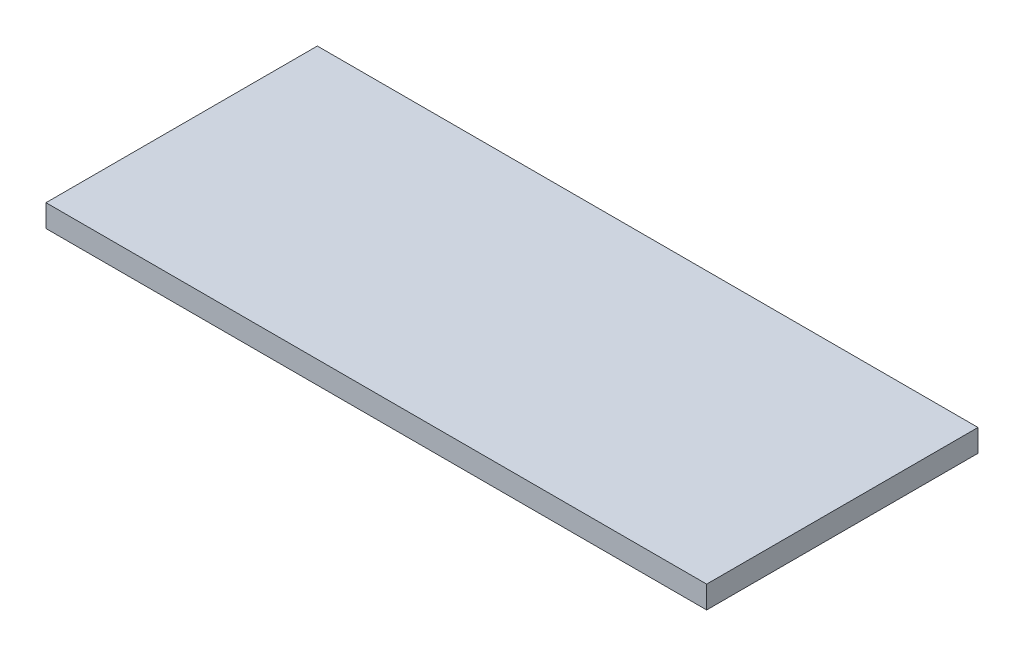
ISO-10303-21;
HEADER;
FILE_DESCRIPTION(('STEP AP214'),'2;1');
FILE_NAME('part.step','',(''),(''),'','','');
FILE_SCHEMA(('AUTOMOTIVE_DESIGN { 1 0 10303 214 1 1 1 1 }'));
ENDSEC;
DATA;
#1=APPLICATION_CONTEXT('core data for automotive mechanical design processes');
#2=APPLICATION_PROTOCOL_DEFINITION('international standard','automotive_design',2000,#1);
#3=PRODUCT_CONTEXT('',#1,'mechanical');
#4=PRODUCT('Part','Part','',(#3));
#5=PRODUCT_RELATED_PRODUCT_CATEGORY('part','',(#4));
#6=PRODUCT_DEFINITION_FORMATION('','',#4);
#7=PRODUCT_DEFINITION_CONTEXT('part definition',#1,'design');
#8=PRODUCT_DEFINITION('design','',#6,#7);
#9=PRODUCT_DEFINITION_SHAPE('','',#8);
#10=(LENGTH_UNIT() NAMED_UNIT(*) SI_UNIT(.MILLI.,.METRE.));
#11=(NAMED_UNIT(*) PLANE_ANGLE_UNIT() SI_UNIT($,.RADIAN.));
#12=(NAMED_UNIT(*) SI_UNIT($,.STERADIAN.) SOLID_ANGLE_UNIT());
#13=UNCERTAINTY_MEASURE_WITH_UNIT(LENGTH_MEASURE(1.E-05),#10,'distance_accuracy_value','');
#14=(GEOMETRIC_REPRESENTATION_CONTEXT(3) GLOBAL_UNCERTAINTY_ASSIGNED_CONTEXT((#13)) GLOBAL_UNIT_ASSIGNED_CONTEXT((#10,
#11,#12)) REPRESENTATION_CONTEXT('',''));
#15=CARTESIAN_POINT('',(0.,0.,0.));
#16=DIRECTION('',(0.,0.,1.));
#17=DIRECTION('',(1.,0.,0.));
#18=AXIS2_PLACEMENT_3D('',#15,#16,#17);
#19=CARTESIAN_POINT('',(0.05,0.832,0.24));
#20=DIRECTION('',(1.,0.,0.));
#21=DIRECTION('',(0.,0.,-1.));
#22=AXIS2_PLACEMENT_3D('',#19,#20,#21);
#23=PLANE('',#22);
#24=DIRECTION('',(0.,0.,-1.));
#25=VECTOR('',#24,1.);
#26=CARTESIAN_POINT('',(0.05,-0.0999999999999999,1.41968162443208));
#27=LINE('',#26,#25);
#28=CARTESIAN_POINT('',(0.0499999999999999,-0.1,0.24));
#29=VERTEX_POINT('',#28);
#30=CARTESIAN_POINT('',(0.0499999999999999,-0.1,-0.22));
#31=VERTEX_POINT('',#30);
#32=EDGE_CURVE('E87',#29,#31,#27,.T.);
#33=ORIENTED_EDGE('',*,*,#32,.T.);
#34=DIRECTION('',(0.,-1.,0.));
#35=VECTOR('',#34,1.);
#36=CARTESIAN_POINT('',(0.05,0.832,-0.22));
#37=LINE('',#36,#35);
#38=CARTESIAN_POINT('',(0.05,-0.138,-0.22));
#39=VERTEX_POINT('',#38);
#40=EDGE_CURVE('E113',#31,#39,#37,.T.);
#41=ORIENTED_EDGE('',*,*,#40,.T.);
#42=DIRECTION('',(0.,0.,-1.));
#43=VECTOR('',#42,1.);
#44=CARTESIAN_POINT('',(0.05,-0.138,1.41968162443208));
#45=LINE('',#44,#43);
#46=CARTESIAN_POINT('',(0.05,-0.138,0.24));
#47=VERTEX_POINT('',#46);
#48=EDGE_CURVE('E119',#47,#39,#45,.T.);
#49=ORIENTED_EDGE('',*,*,#48,.F.);
#50=DIRECTION('',(0.,1.,0.));
#51=VECTOR('',#50,1.);
#52=CARTESIAN_POINT('',(0.05,0.,0.24));
#53=LINE('',#52,#51);
#54=EDGE_CURVE('E50',#47,#29,#53,.T.);
#55=ORIENTED_EDGE('',*,*,#54,.T.);
#56=EDGE_LOOP('',(#33,#41,#49,#55));
#57=FACE_BOUND('',#56,.T.);
#58=ADVANCED_FACE('F33',(#57),#23,.F.);
#59=CARTESIAN_POINT('',(1.17,0.546,0.24));
#60=DIRECTION('',(-1.,0.,0.));
#61=DIRECTION('',(0.,0.,1.));
#62=AXIS2_PLACEMENT_3D('',#59,#60,#61);
#63=PLANE('',#62);
#64=DIRECTION('',(0.,0.,-1.));
#65=VECTOR('',#64,1.);
#66=CARTESIAN_POINT('',(1.17,-0.138,1.41968162443208));
#67=LINE('',#66,#65);
#68=CARTESIAN_POINT('',(1.17,-0.138,0.24));
#69=VERTEX_POINT('',#68);
#70=CARTESIAN_POINT('',(1.17,-0.138,-0.22));
#71=VERTEX_POINT('',#70);
#72=EDGE_CURVE('E76',#69,#71,#67,.T.);
#73=ORIENTED_EDGE('',*,*,#72,.T.);
#74=DIRECTION('',(0.,-1.,0.));
#75=VECTOR('',#74,1.);
#76=CARTESIAN_POINT('',(1.17,0.832,-0.22));
#77=LINE('',#76,#75);
#78=CARTESIAN_POINT('',(1.17,-0.1,-0.22));
#79=VERTEX_POINT('',#78);
#80=EDGE_CURVE('E37',#79,#71,#77,.T.);
#81=ORIENTED_EDGE('',*,*,#80,.F.);
#82=DIRECTION('',(0.,0.,-1.));
#83=VECTOR('',#82,1.);
#84=CARTESIAN_POINT('',(1.17,-0.0999999999999999,1.41968162443208));
#85=LINE('',#84,#83);
#86=CARTESIAN_POINT('',(1.17,-0.1,0.24));
#87=VERTEX_POINT('',#86);
#88=EDGE_CURVE('E78',#87,#79,#85,.T.);
#89=ORIENTED_EDGE('',*,*,#88,.F.);
#90=DIRECTION('',(0.,-1.,0.));
#91=VECTOR('',#90,1.);
#92=CARTESIAN_POINT('',(1.17,0.,0.24));
#93=LINE('',#92,#91);
#94=EDGE_CURVE('E55',#87,#69,#93,.T.);
#95=ORIENTED_EDGE('',*,*,#94,.T.);
#96=EDGE_LOOP('',(#73,#81,#89,#95));
#97=FACE_BOUND('',#96,.T.);
#98=ADVANCED_FACE('F74',(#97),#63,.F.);
#99=CARTESIAN_POINT('',(1.17,0.832,-0.22));
#100=DIRECTION('',(0.,0.,1.));
#101=DIRECTION('',(0.,-1.,0.));
#102=AXIS2_PLACEMENT_3D('',#99,#100,#101);
#103=PLANE('',#102);
#104=ORIENTED_EDGE('',*,*,#80,.T.);
#105=DIRECTION('',(1.,0.,0.));
#106=VECTOR('',#105,1.);
#107=CARTESIAN_POINT('',(1.17,-0.138,-0.22));
#108=LINE('',#107,#106);
#109=EDGE_CURVE('E85',#39,#71,#108,.T.);
#110=ORIENTED_EDGE('',*,*,#109,.F.);
#111=ORIENTED_EDGE('',*,*,#40,.F.);
#112=DIRECTION('',(-1.,0.,0.));
#113=VECTOR('',#112,1.);
#114=CARTESIAN_POINT('',(1.19,-0.1,-0.22));
#115=LINE('',#114,#113);
#116=EDGE_CURVE('E80',#79,#31,#115,.T.);
#117=ORIENTED_EDGE('',*,*,#116,.F.);
#118=EDGE_LOOP('',(#104,#110,#111,#117));
#119=FACE_BOUND('',#118,.T.);
#120=ADVANCED_FACE('F96',(#119),#103,.F.);
#121=CARTESIAN_POINT('',(1.19,-0.0999999999999999,0.22));
#122=DIRECTION('',(0.,-1.,0.));
#123=DIRECTION('',(0.,0.,-1.));
#124=AXIS2_PLACEMENT_3D('',#121,#122,#123);
#125=PLANE('',#124);
#126=ORIENTED_EDGE('',*,*,#32,.F.);
#127=DIRECTION('',(1.,0.,0.));
#128=VECTOR('',#127,1.);
#129=CARTESIAN_POINT('',(0.0499999999999999,-0.1,0.24));
#130=LINE('',#129,#128);
#131=EDGE_CURVE('E42',#29,#87,#130,.T.);
#132=ORIENTED_EDGE('',*,*,#131,.T.);
#133=ORIENTED_EDGE('',*,*,#88,.T.);
#134=ORIENTED_EDGE('',*,*,#116,.T.);
#135=EDGE_LOOP('',(#126,#132,#133,#134));
#136=FACE_BOUND('',#135,.T.);
#137=ADVANCED_FACE('F90',(#136),#125,.F.);
#138=CARTESIAN_POINT('',(0.,0.,0.24));
#139=DIRECTION('',(0.,0.,1.));
#140=DIRECTION('',(1.,0.,0.));
#141=AXIS2_PLACEMENT_3D('',#138,#139,#140);
#142=PLANE('',#141);
#143=ORIENTED_EDGE('',*,*,#94,.F.);
#144=ORIENTED_EDGE('',*,*,#131,.F.);
#145=ORIENTED_EDGE('',*,*,#54,.F.);
#146=DIRECTION('',(-1.,0.,0.));
#147=VECTOR('',#146,1.);
#148=CARTESIAN_POINT('',(1.17,-0.138,0.24));
#149=LINE('',#148,#147);
#150=EDGE_CURVE('E11',#69,#47,#149,.T.);
#151=ORIENTED_EDGE('',*,*,#150,.F.);
#152=EDGE_LOOP('',(#143,#144,#145,#151));
#153=FACE_BOUND('',#152,.T.);
#154=ADVANCED_FACE('F35',(#153),#142,.T.);
#155=CARTESIAN_POINT('',(1.17,-0.138,1.41968162443208));
#156=DIRECTION('',(0.,1.,0.));
#157=DIRECTION('',(-1.,0.,0.));
#158=AXIS2_PLACEMENT_3D('',#155,#156,#157);
#159=PLANE('',#158);
#160=ORIENTED_EDGE('',*,*,#72,.F.);
#161=ORIENTED_EDGE('',*,*,#150,.T.);
#162=ORIENTED_EDGE('',*,*,#48,.T.);
#163=ORIENTED_EDGE('',*,*,#109,.T.);
#164=EDGE_LOOP('',(#160,#161,#162,#163));
#165=FACE_BOUND('',#164,.T.);
#166=ADVANCED_FACE('F83',(#165),#159,.F.);
#167=CLOSED_SHELL('',(#58,#98,#120,#137,#154,#166));
#168=MANIFOLD_SOLID_BREP('B2',#167);
#169=ADVANCED_BREP_SHAPE_REPRESENTATION('',(#18,#168),#14);
#170=SHAPE_DEFINITION_REPRESENTATION(#9,#169);
ENDSEC;
END-ISO-10303-21;
